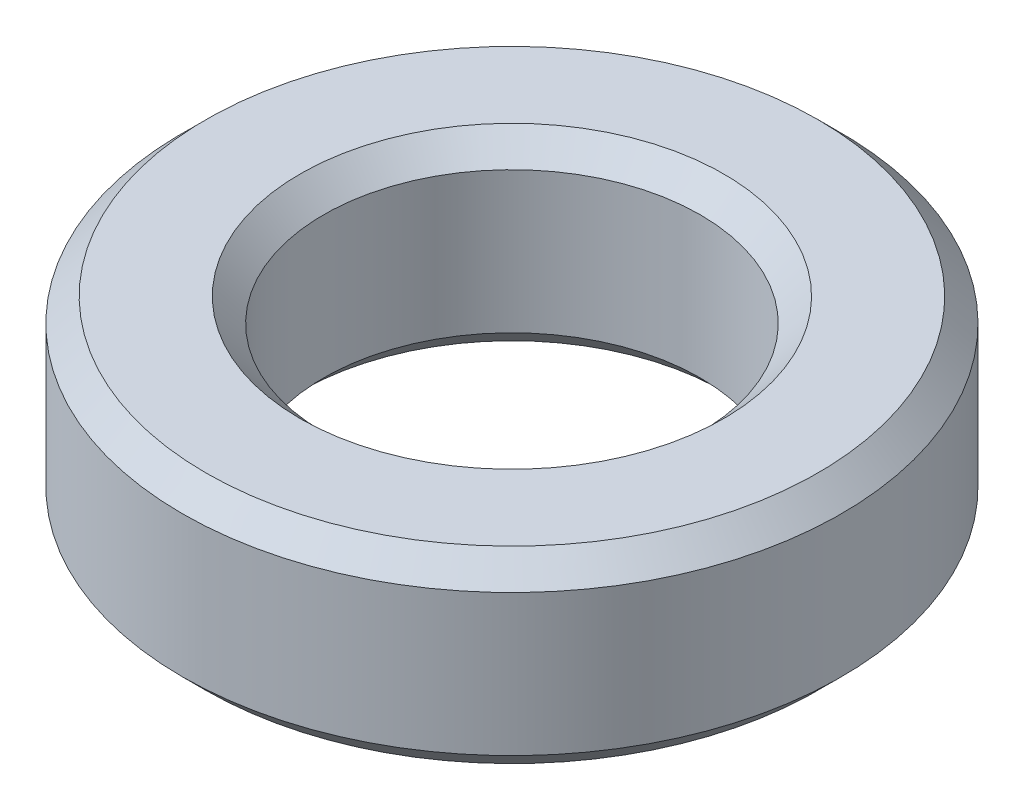
ISO-10303-21;
HEADER;
FILE_DESCRIPTION(('STEP AP214'),'2;1');
FILE_NAME('part.step','',(''),(''),'','','');
FILE_SCHEMA(('AUTOMOTIVE_DESIGN { 1 0 10303 214 1 1 1 1 }'));
ENDSEC;
DATA;
#1=APPLICATION_CONTEXT('core data for automotive mechanical design processes');
#2=APPLICATION_PROTOCOL_DEFINITION('international standard','automotive_design',2000,#1);
#3=PRODUCT_CONTEXT('',#1,'mechanical');
#4=PRODUCT('Part','Part','',(#3));
#5=PRODUCT_RELATED_PRODUCT_CATEGORY('part','',(#4));
#6=PRODUCT_DEFINITION_FORMATION('','',#4);
#7=PRODUCT_DEFINITION_CONTEXT('part definition',#1,'design');
#8=PRODUCT_DEFINITION('design','',#6,#7);
#9=PRODUCT_DEFINITION_SHAPE('','',#8);
#10=(LENGTH_UNIT() NAMED_UNIT(*) SI_UNIT(.MILLI.,.METRE.));
#11=(NAMED_UNIT(*) PLANE_ANGLE_UNIT() SI_UNIT($,.RADIAN.));
#12=(NAMED_UNIT(*) SI_UNIT($,.STERADIAN.) SOLID_ANGLE_UNIT());
#13=UNCERTAINTY_MEASURE_WITH_UNIT(LENGTH_MEASURE(1.E-05),#10,'distance_accuracy_value','');
#14=(GEOMETRIC_REPRESENTATION_CONTEXT(3) GLOBAL_UNCERTAINTY_ASSIGNED_CONTEXT((#13)) GLOBAL_UNIT_ASSIGNED_CONTEXT((#10,
#11,#12)) REPRESENTATION_CONTEXT('',''));
#15=CARTESIAN_POINT('',(0.,0.,0.));
#16=DIRECTION('',(0.,0.,1.));
#17=DIRECTION('',(1.,0.,0.));
#18=AXIS2_PLACEMENT_3D('',#15,#16,#17);
#19=CARTESIAN_POINT('',(0.,4.,0.));
#20=DIRECTION('',(0.,1.,0.));
#21=DIRECTION('',(0.,0.,1.));
#22=AXIS2_PLACEMENT_3D('',#19,#20,#21);
#23=PLANE('',#22);
#24=CARTESIAN_POINT('',(0.,4.,0.));
#25=DIRECTION('',(0.,1.,0.));
#26=DIRECTION('',(0.,0.,1.));
#27=AXIS2_PLACEMENT_3D('',#24,#25,#26);
#28=CIRCLE('',#27,4.5);
#29=CARTESIAN_POINT('',(0.,4.,4.5));
#30=VERTEX_POINT('',#29);
#31=EDGE_CURVE('E41',#30,#30,#28,.F.);
#32=ORIENTED_EDGE('',*,*,#31,.T.);
#33=EDGE_LOOP('',(#32));
#34=FACE_BOUND('',#33,.T.);
#35=CARTESIAN_POINT('',(0.,4.,0.));
#36=DIRECTION('',(0.,1.,0.));
#37=DIRECTION('',(0.,0.,1.));
#38=AXIS2_PLACEMENT_3D('',#35,#36,#37);
#39=CIRCLE('',#38,6.50000000000002);
#40=CARTESIAN_POINT('',(0.,4.,6.50000000000002));
#41=VERTEX_POINT('',#40);
#42=EDGE_CURVE('E45',#41,#41,#39,.T.);
#43=ORIENTED_EDGE('',*,*,#42,.T.);
#44=EDGE_LOOP('',(#43));
#45=FACE_BOUND('',#44,.T.);
#46=ADVANCED_FACE('F30',(#34,#45),#23,.T.);
#47=CARTESIAN_POINT('',(0.,0.,0.));
#48=DIRECTION('',(0.,1.,0.));
#49=DIRECTION('',(0.,0.,1.));
#50=AXIS2_PLACEMENT_3D('',#47,#48,#49);
#51=PLANE('',#50);
#52=CARTESIAN_POINT('',(0.,0.,0.));
#53=DIRECTION('',(0.,1.,0.));
#54=DIRECTION('',(0.,0.,1.));
#55=AXIS2_PLACEMENT_3D('',#52,#53,#54);
#56=CIRCLE('',#55,4.49999999999999);
#57=CARTESIAN_POINT('',(0.,0.,4.49999999999999));
#58=VERTEX_POINT('',#57);
#59=EDGE_CURVE('E56',#58,#58,#56,.T.);
#60=ORIENTED_EDGE('',*,*,#59,.T.);
#61=EDGE_LOOP('',(#60));
#62=FACE_BOUND('',#61,.T.);
#63=CARTESIAN_POINT('',(0.,0.,0.));
#64=DIRECTION('',(0.,1.,0.));
#65=DIRECTION('',(0.,0.,1.));
#66=AXIS2_PLACEMENT_3D('',#63,#64,#65);
#67=CIRCLE('',#66,6.50000000000001);
#68=CARTESIAN_POINT('',(0.,0.,6.50000000000001));
#69=VERTEX_POINT('',#68);
#70=EDGE_CURVE('E59',#69,#69,#67,.F.);
#71=ORIENTED_EDGE('',*,*,#70,.T.);
#72=EDGE_LOOP('',(#71));
#73=FACE_BOUND('',#72,.T.);
#74=ADVANCED_FACE('F63',(#62,#73),#51,.F.);
#75=CARTESIAN_POINT('',(0.,4.,0.));
#76=DIRECTION('',(0.,-1.,0.));
#77=DIRECTION('',(0.,0.,-1.));
#78=AXIS2_PLACEMENT_3D('',#75,#76,#77);
#79=CYLINDRICAL_SURFACE('',#78,7.00000000000002);
#80=CARTESIAN_POINT('',(0.,3.5,0.));
#81=DIRECTION('',(0.,1.,0.));
#82=DIRECTION('',(0.,0.,1.));
#83=AXIS2_PLACEMENT_3D('',#80,#81,#82);
#84=CIRCLE('',#83,7.00000000000002);
#85=CARTESIAN_POINT('',(0.,3.5,7.00000000000002));
#86=VERTEX_POINT('',#85);
#87=EDGE_CURVE('E10',#86,#86,#84,.F.);
#88=ORIENTED_EDGE('',*,*,#87,.T.);
#89=EDGE_LOOP('',(#88));
#90=FACE_BOUND('',#89,.T.);
#91=CARTESIAN_POINT('',(0.,0.499999999999999,0.));
#92=DIRECTION('',(0.,1.,0.));
#93=DIRECTION('',(0.,0.,1.));
#94=AXIS2_PLACEMENT_3D('',#91,#92,#93);
#95=CIRCLE('',#94,7.00000000000002);
#96=CARTESIAN_POINT('',(0.,0.499999999999999,7.00000000000002));
#97=VERTEX_POINT('',#96);
#98=EDGE_CURVE('E37',#97,#97,#95,.T.);
#99=ORIENTED_EDGE('',*,*,#98,.T.);
#100=EDGE_LOOP('',(#99));
#101=FACE_BOUND('',#100,.T.);
#102=ADVANCED_FACE('F79',(#90,#101),#79,.T.);
#103=CARTESIAN_POINT('',(0.,4.,0.));
#104=DIRECTION('',(0.,-1.,0.));
#105=DIRECTION('',(0.,0.,-1.));
#106=AXIS2_PLACEMENT_3D('',#103,#104,#105);
#107=CYLINDRICAL_SURFACE('',#106,3.99999999999999);
#108=CARTESIAN_POINT('',(0.,0.500000000000002,0.));
#109=DIRECTION('',(0.,1.,0.));
#110=DIRECTION('',(0.,0.,1.));
#111=AXIS2_PLACEMENT_3D('',#108,#109,#110);
#112=CIRCLE('',#111,3.99999999999999);
#113=CARTESIAN_POINT('',(0.,0.500000000000002,3.99999999999999));
#114=VERTEX_POINT('',#113);
#115=EDGE_CURVE('E50',#114,#114,#112,.F.);
#116=ORIENTED_EDGE('',*,*,#115,.T.);
#117=EDGE_LOOP('',(#116));
#118=FACE_BOUND('',#117,.T.);
#119=CARTESIAN_POINT('',(0.,3.5,0.));
#120=DIRECTION('',(0.,1.,0.));
#121=DIRECTION('',(0.,0.,1.));
#122=AXIS2_PLACEMENT_3D('',#119,#120,#121);
#123=CIRCLE('',#122,3.99999999999999);
#124=CARTESIAN_POINT('',(0.,3.5,3.99999999999999));
#125=VERTEX_POINT('',#124);
#126=EDGE_CURVE('E53',#125,#125,#123,.T.);
#127=ORIENTED_EDGE('',*,*,#126,.T.);
#128=EDGE_LOOP('',(#127));
#129=FACE_BOUND('',#128,.T.);
#130=ADVANCED_FACE('F84',(#118,#129),#107,.F.);
#131=CARTESIAN_POINT('',(0.,0.,0.));
#132=DIRECTION('',(0.,-1.,0.));
#133=DIRECTION('',(0.,0.,-1.));
#134=AXIS2_PLACEMENT_3D('',#131,#132,#133);
#135=CONICAL_SURFACE('',#134,4.49999999999999,0.785398163397447);
#136=ORIENTED_EDGE('',*,*,#115,.F.);
#137=EDGE_LOOP('',(#136));
#138=FACE_BOUND('',#137,.T.);
#139=ORIENTED_EDGE('',*,*,#59,.F.);
#140=EDGE_LOOP('',(#139));
#141=FACE_BOUND('',#140,.T.);
#142=ADVANCED_FACE('F88',(#138,#141),#135,.F.);
#143=CARTESIAN_POINT('',(0.,3.5,0.));
#144=DIRECTION('',(0.,1.,0.));
#145=DIRECTION('',(0.,0.,1.));
#146=AXIS2_PLACEMENT_3D('',#143,#144,#145);
#147=CONICAL_SURFACE('',#146,3.99999999999999,0.785398163397452);
#148=ORIENTED_EDGE('',*,*,#31,.F.);
#149=EDGE_LOOP('',(#148));
#150=FACE_BOUND('',#149,.T.);
#151=ORIENTED_EDGE('',*,*,#126,.F.);
#152=EDGE_LOOP('',(#151));
#153=FACE_BOUND('',#152,.T.);
#154=ADVANCED_FACE('F71',(#150,#153),#147,.F.);
#155=CARTESIAN_POINT('',(0.,4.,0.));
#156=DIRECTION('',(0.,-1.,0.));
#157=DIRECTION('',(0.,0.,-1.));
#158=AXIS2_PLACEMENT_3D('',#155,#156,#157);
#159=CONICAL_SURFACE('',#158,6.50000000000002,0.785398163397445);
#160=ORIENTED_EDGE('',*,*,#87,.F.);
#161=EDGE_LOOP('',(#160));
#162=FACE_BOUND('',#161,.T.);
#163=ORIENTED_EDGE('',*,*,#42,.F.);
#164=EDGE_LOOP('',(#163));
#165=FACE_BOUND('',#164,.T.);
#166=ADVANCED_FACE('F67',(#162,#165),#159,.T.);
#167=CARTESIAN_POINT('',(0.,0.499999999999999,0.));
#168=DIRECTION('',(0.,1.,0.));
#169=DIRECTION('',(0.,0.,1.));
#170=AXIS2_PLACEMENT_3D('',#167,#168,#169);
#171=CONICAL_SURFACE('',#170,7.00000000000002,0.785398163397451);
#172=ORIENTED_EDGE('',*,*,#70,.F.);
#173=EDGE_LOOP('',(#172));
#174=FACE_BOUND('',#173,.T.);
#175=ORIENTED_EDGE('',*,*,#98,.F.);
#176=EDGE_LOOP('',(#175));
#177=FACE_BOUND('',#176,.T.);
#178=ADVANCED_FACE('F32',(#174,#177),#171,.T.);
#179=CLOSED_SHELL('',(#46,#74,#102,#130,#142,#154,#166,#178));
#180=MANIFOLD_SOLID_BREP('B2',#179);
#181=ADVANCED_BREP_SHAPE_REPRESENTATION('',(#18,#180),#14);
#182=SHAPE_DEFINITION_REPRESENTATION(#9,#181);
ENDSEC;
END-ISO-10303-21;
